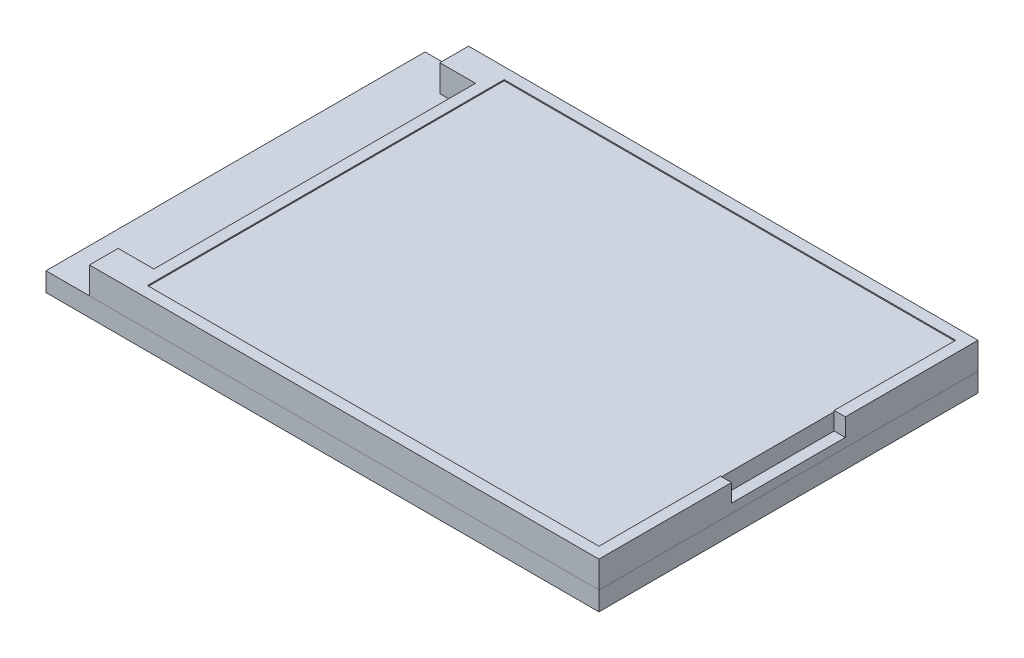
ISO-10303-21;
HEADER;
FILE_DESCRIPTION(('STEP AP214'),'2;1');
FILE_NAME('part.step','',(''),(''),'','','');
FILE_SCHEMA(('AUTOMOTIVE_DESIGN { 1 0 10303 214 1 1 1 1 }'));
ENDSEC;
DATA;
#1=APPLICATION_CONTEXT('core data for automotive mechanical design processes');
#2=APPLICATION_PROTOCOL_DEFINITION('international standard','automotive_design',2000,#1);
#3=PRODUCT_CONTEXT('',#1,'mechanical');
#4=PRODUCT('Part','Part','',(#3));
#5=PRODUCT_RELATED_PRODUCT_CATEGORY('part','',(#4));
#6=PRODUCT_DEFINITION_FORMATION('','',#4);
#7=PRODUCT_DEFINITION_CONTEXT('part definition',#1,'design');
#8=PRODUCT_DEFINITION('design','',#6,#7);
#9=PRODUCT_DEFINITION_SHAPE('','',#8);
#10=(LENGTH_UNIT() NAMED_UNIT(*) SI_UNIT(.MILLI.,.METRE.));
#11=(NAMED_UNIT(*) PLANE_ANGLE_UNIT() SI_UNIT($,.RADIAN.));
#12=(NAMED_UNIT(*) SI_UNIT($,.STERADIAN.) SOLID_ANGLE_UNIT());
#13=UNCERTAINTY_MEASURE_WITH_UNIT(LENGTH_MEASURE(1.E-05),#10,'distance_accuracy_value','');
#14=(GEOMETRIC_REPRESENTATION_CONTEXT(3) GLOBAL_UNCERTAINTY_ASSIGNED_CONTEXT((#13)) GLOBAL_UNIT_ASSIGNED_CONTEXT((#10,
#11,#12)) REPRESENTATION_CONTEXT('',''));
#15=CARTESIAN_POINT('',(0.,0.,0.));
#16=DIRECTION('',(0.,0.,1.));
#17=DIRECTION('',(1.,0.,0.));
#18=AXIS2_PLACEMENT_3D('',#15,#16,#17);
#19=CARTESIAN_POINT('',(23.8,4.,-16.));
#20=DIRECTION('',(1.,0.,0.));
#21=DIRECTION('',(0.,0.,-1.));
#22=AXIS2_PLACEMENT_3D('',#19,#20,#21);
#23=PLANE('',#22);
#24=DIRECTION('',(0.,0.,-1.));
#25=VECTOR('',#24,1.);
#26=CARTESIAN_POINT('',(23.8,4.1,-16.));
#27=LINE('',#26,#25);
#28=CARTESIAN_POINT('',(23.8,4.1,16.));
#29=VERTEX_POINT('',#28);
#30=CARTESIAN_POINT('',(23.8,4.1,5.1));
#31=VERTEX_POINT('',#30);
#32=EDGE_CURVE('E220',#29,#31,#27,.T.);
#33=ORIENTED_EDGE('',*,*,#32,.T.);
#34=DIRECTION('',(0.,1.,0.));
#35=VECTOR('',#34,1.);
#36=CARTESIAN_POINT('',(23.8,2.5,5.1));
#37=LINE('',#36,#35);
#38=CARTESIAN_POINT('',(23.8,4.,5.1));
#39=VERTEX_POINT('',#38);
#40=EDGE_CURVE('E327',#39,#31,#37,.T.);
#41=ORIENTED_EDGE('',*,*,#40,.F.);
#42=DIRECTION('',(0.,0.,-1.));
#43=VECTOR('',#42,1.);
#44=CARTESIAN_POINT('',(23.8,4.,-16.));
#45=LINE('',#44,#43);
#46=CARTESIAN_POINT('',(23.8,4.,16.));
#47=VERTEX_POINT('',#46);
#48=EDGE_CURVE('E206',#47,#39,#45,.T.);
#49=ORIENTED_EDGE('',*,*,#48,.F.);
#50=DIRECTION('',(0.,1.,0.));
#51=VECTOR('',#50,1.);
#52=CARTESIAN_POINT('',(23.8,4.,16.));
#53=LINE('',#52,#51);
#54=EDGE_CURVE('E231',#47,#29,#53,.T.);
#55=ORIENTED_EDGE('',*,*,#54,.T.);
#56=EDGE_LOOP('',(#33,#41,#49,#55));
#57=FACE_BOUND('',#56,.T.);
#58=ADVANCED_FACE('F49',(#57),#23,.F.);
#59=CARTESIAN_POINT('',(0.,4.1,-14.425));
#60=DIRECTION('',(0.,0.,-1.));
#61=DIRECTION('',(-1.,0.,0.));
#62=AXIS2_PLACEMENT_3D('',#59,#60,#61);
#63=PLANE('',#62);
#64=DIRECTION('',(1.,0.,0.));
#65=VECTOR('',#64,1.);
#66=CARTESIAN_POINT('',(0.,1.7,-14.425));
#67=LINE('',#66,#65);
#68=CARTESIAN_POINT('',(-20.9,1.7,-14.425));
#69=VERTEX_POINT('',#68);
#70=CARTESIAN_POINT('',(-17.7,1.7,-14.425));
#71=VERTEX_POINT('',#70);
#72=EDGE_CURVE('E227',#69,#71,#67,.T.);
#73=ORIENTED_EDGE('',*,*,#72,.T.);
#74=DIRECTION('',(0.,-1.,0.));
#75=VECTOR('',#74,1.);
#76=CARTESIAN_POINT('',(-17.7,4.1,-14.425));
#77=LINE('',#76,#75);
#78=CARTESIAN_POINT('',(-17.7,4.1,-14.425));
#79=VERTEX_POINT('',#78);
#80=EDGE_CURVE('E12',#79,#71,#77,.T.);
#81=ORIENTED_EDGE('',*,*,#80,.F.);
#82=DIRECTION('',(1.,0.,0.));
#83=VECTOR('',#82,1.);
#84=CARTESIAN_POINT('',(0.,4.1,-14.425));
#85=LINE('',#84,#83);
#86=CARTESIAN_POINT('',(-20.9,4.1,-14.425));
#87=VERTEX_POINT('',#86);
#88=EDGE_CURVE('E234',#87,#79,#85,.T.);
#89=ORIENTED_EDGE('',*,*,#88,.F.);
#90=DIRECTION('',(0.,-1.,0.));
#91=VECTOR('',#90,1.);
#92=CARTESIAN_POINT('',(-20.9,4.1,-14.425));
#93=LINE('',#92,#91);
#94=EDGE_CURVE('E269',#87,#69,#93,.T.);
#95=ORIENTED_EDGE('',*,*,#94,.T.);
#96=EDGE_LOOP('',(#73,#81,#89,#95));
#97=FACE_BOUND('',#96,.T.);
#98=ADVANCED_FACE('F51',(#97),#63,.F.);
#99=CARTESIAN_POINT('',(-17.7,4.1,0.));
#100=DIRECTION('',(1.,0.,0.));
#101=DIRECTION('',(0.,0.,-1.));
#102=AXIS2_PLACEMENT_3D('',#99,#100,#101);
#103=PLANE('',#102);
#104=DIRECTION('',(0.,0.,1.));
#105=VECTOR('',#104,1.);
#106=CARTESIAN_POINT('',(-17.7,1.7,0.));
#107=LINE('',#106,#105);
#108=CARTESIAN_POINT('',(-17.7,1.7,14.425));
#109=VERTEX_POINT('',#108);
#110=EDGE_CURVE('E255',#71,#109,#107,.T.);
#111=ORIENTED_EDGE('',*,*,#110,.T.);
#112=DIRECTION('',(0.,-1.,0.));
#113=VECTOR('',#112,1.);
#114=CARTESIAN_POINT('',(-17.7,4.1,14.425));
#115=LINE('',#114,#113);
#116=CARTESIAN_POINT('',(-17.7,4.1,14.425));
#117=VERTEX_POINT('',#116);
#118=EDGE_CURVE('E57',#117,#109,#115,.T.);
#119=ORIENTED_EDGE('',*,*,#118,.F.);
#120=DIRECTION('',(0.,0.,1.));
#121=VECTOR('',#120,1.);
#122=CARTESIAN_POINT('',(-17.7,4.1,0.));
#123=LINE('',#122,#121);
#124=EDGE_CURVE('E237',#79,#117,#123,.T.);
#125=ORIENTED_EDGE('',*,*,#124,.F.);
#126=ORIENTED_EDGE('',*,*,#80,.T.);
#127=EDGE_LOOP('',(#111,#119,#125,#126));
#128=FACE_BOUND('',#127,.T.);
#129=ADVANCED_FACE('F291',(#128),#103,.F.);
#130=CARTESIAN_POINT('',(0.,4.1,14.425));
#131=DIRECTION('',(0.,0.,-1.));
#132=DIRECTION('',(-1.,0.,0.));
#133=AXIS2_PLACEMENT_3D('',#130,#131,#132);
#134=PLANE('',#133);
#135=DIRECTION('',(1.,0.,0.));
#136=VECTOR('',#135,1.);
#137=CARTESIAN_POINT('',(0.,1.7,14.425));
#138=LINE('',#137,#136);
#139=CARTESIAN_POINT('',(-20.9,1.7,14.425));
#140=VERTEX_POINT('',#139);
#141=EDGE_CURVE('E258',#140,#109,#138,.T.);
#142=ORIENTED_EDGE('',*,*,#141,.F.);
#143=DIRECTION('',(0.,-1.,0.));
#144=VECTOR('',#143,1.);
#145=CARTESIAN_POINT('',(-20.9,4.1,14.425));
#146=LINE('',#145,#144);
#147=CARTESIAN_POINT('',(-20.9,4.1,14.425));
#148=VERTEX_POINT('',#147);
#149=EDGE_CURVE('E284',#148,#140,#146,.T.);
#150=ORIENTED_EDGE('',*,*,#149,.F.);
#151=DIRECTION('',(1.,0.,0.));
#152=VECTOR('',#151,1.);
#153=CARTESIAN_POINT('',(0.,4.1,14.425));
#154=LINE('',#153,#152);
#155=EDGE_CURVE('E240',#148,#117,#154,.T.);
#156=ORIENTED_EDGE('',*,*,#155,.T.);
#157=ORIENTED_EDGE('',*,*,#118,.T.);
#158=EDGE_LOOP('',(#142,#150,#156,#157));
#159=FACE_BOUND('',#158,.T.);
#160=ADVANCED_FACE('F288',(#159),#134,.T.);
#161=CARTESIAN_POINT('',(-20.9,4.1,0.));
#162=DIRECTION('',(1.,0.,0.));
#163=DIRECTION('',(0.,0.,-1.));
#164=AXIS2_PLACEMENT_3D('',#161,#162,#163);
#165=PLANE('',#164);
#166=DIRECTION('',(0.,0.,1.));
#167=VECTOR('',#166,1.);
#168=CARTESIAN_POINT('',(-20.9,1.7,0.));
#169=LINE('',#168,#167);
#170=CARTESIAN_POINT('',(-20.9,1.7,17.));
#171=VERTEX_POINT('',#170);
#172=EDGE_CURVE('E261',#140,#171,#169,.T.);
#173=ORIENTED_EDGE('',*,*,#172,.T.);
#174=DIRECTION('',(0.,-1.,0.));
#175=VECTOR('',#174,1.);
#176=CARTESIAN_POINT('',(-20.9,4.1,17.));
#177=LINE('',#176,#175);
#178=CARTESIAN_POINT('',(-20.9,4.1,17.));
#179=VERTEX_POINT('',#178);
#180=EDGE_CURVE('E281',#179,#171,#177,.T.);
#181=ORIENTED_EDGE('',*,*,#180,.F.);
#182=DIRECTION('',(0.,0.,1.));
#183=VECTOR('',#182,1.);
#184=CARTESIAN_POINT('',(-20.9,4.1,0.));
#185=LINE('',#184,#183);
#186=EDGE_CURVE('E243',#148,#179,#185,.T.);
#187=ORIENTED_EDGE('',*,*,#186,.F.);
#188=ORIENTED_EDGE('',*,*,#149,.T.);
#189=EDGE_LOOP('',(#173,#181,#187,#188));
#190=FACE_BOUND('',#189,.T.);
#191=ADVANCED_FACE('F301',(#190),#165,.F.);
#192=CARTESIAN_POINT('',(0.,4.1,17.));
#193=DIRECTION('',(0.,0.,-1.));
#194=DIRECTION('',(-1.,0.,0.));
#195=AXIS2_PLACEMENT_3D('',#192,#193,#194);
#196=PLANE('',#195);
#197=DIRECTION('',(1.,0.,0.));
#198=VECTOR('',#197,1.);
#199=CARTESIAN_POINT('',(0.,1.7,17.));
#200=LINE('',#199,#198);
#201=CARTESIAN_POINT('',(24.8,1.7,17.));
#202=VERTEX_POINT('',#201);
#203=EDGE_CURVE('E263',#171,#202,#200,.T.);
#204=ORIENTED_EDGE('',*,*,#203,.T.);
#205=DIRECTION('',(0.,-1.,0.));
#206=VECTOR('',#205,1.);
#207=CARTESIAN_POINT('',(24.8,4.1,17.));
#208=LINE('',#207,#206);
#209=CARTESIAN_POINT('',(24.8,4.1,17.));
#210=VERTEX_POINT('',#209);
#211=EDGE_CURVE('E278',#210,#202,#208,.T.);
#212=ORIENTED_EDGE('',*,*,#211,.F.);
#213=DIRECTION('',(1.,0.,0.));
#214=VECTOR('',#213,1.);
#215=CARTESIAN_POINT('',(0.,4.1,17.));
#216=LINE('',#215,#214);
#217=EDGE_CURVE('E245',#179,#210,#216,.T.);
#218=ORIENTED_EDGE('',*,*,#217,.F.);
#219=ORIENTED_EDGE('',*,*,#180,.T.);
#220=EDGE_LOOP('',(#204,#212,#218,#219));
#221=FACE_BOUND('',#220,.T.);
#222=ADVANCED_FACE('F305',(#221),#196,.F.);
#223=CARTESIAN_POINT('',(24.8,4.1,0.));
#224=DIRECTION('',(-1.,0.,0.));
#225=DIRECTION('',(0.,0.,1.));
#226=AXIS2_PLACEMENT_3D('',#223,#224,#225);
#227=PLANE('',#226);
#228=DIRECTION('',(0.,0.,-1.));
#229=VECTOR('',#228,1.);
#230=CARTESIAN_POINT('',(24.8,2.5,-5.1));
#231=LINE('',#230,#229);
#232=CARTESIAN_POINT('',(24.8,2.5,5.1));
#233=VERTEX_POINT('',#232);
#234=CARTESIAN_POINT('',(24.8,2.5,-5.1));
#235=VERTEX_POINT('',#234);
#236=EDGE_CURVE('E176',#233,#235,#231,.T.);
#237=ORIENTED_EDGE('',*,*,#236,.F.);
#238=DIRECTION('',(0.,1.,0.));
#239=VECTOR('',#238,1.);
#240=CARTESIAN_POINT('',(24.8,2.5,5.1));
#241=LINE('',#240,#239);
#242=CARTESIAN_POINT('',(24.8,4.1,5.1));
#243=VERTEX_POINT('',#242);
#244=EDGE_CURVE('E216',#233,#243,#241,.T.);
#245=ORIENTED_EDGE('',*,*,#244,.T.);
#246=DIRECTION('',(0.,0.,-1.));
#247=VECTOR('',#246,1.);
#248=CARTESIAN_POINT('',(24.8,4.1,0.));
#249=LINE('',#248,#247);
#250=EDGE_CURVE('E248',#210,#243,#249,.T.);
#251=ORIENTED_EDGE('',*,*,#250,.F.);
#252=ORIENTED_EDGE('',*,*,#211,.T.);
#253=DIRECTION('',(0.,0.,-1.));
#254=VECTOR('',#253,1.);
#255=CARTESIAN_POINT('',(24.8,1.7,0.));
#256=LINE('',#255,#254);
#257=CARTESIAN_POINT('',(24.8,1.7,-17.));
#258=VERTEX_POINT('',#257);
#259=EDGE_CURVE('E265',#202,#258,#256,.T.);
#260=ORIENTED_EDGE('',*,*,#259,.T.);
#261=DIRECTION('',(0.,-1.,0.));
#262=VECTOR('',#261,1.);
#263=CARTESIAN_POINT('',(24.8,4.1,-17.));
#264=LINE('',#263,#262);
#265=CARTESIAN_POINT('',(24.8,4.1,-17.));
#266=VERTEX_POINT('',#265);
#267=EDGE_CURVE('E275',#266,#258,#264,.T.);
#268=ORIENTED_EDGE('',*,*,#267,.F.);
#269=CARTESIAN_POINT('',(24.8,4.1,-5.1));
#270=VERTEX_POINT('',#269);
#271=EDGE_CURVE('E190',#270,#266,#249,.T.);
#272=ORIENTED_EDGE('',*,*,#271,.F.);
#273=DIRECTION('',(0.,1.,0.));
#274=VECTOR('',#273,1.);
#275=CARTESIAN_POINT('',(24.8,2.5,-5.1));
#276=LINE('',#275,#274);
#277=EDGE_CURVE('E171',#235,#270,#276,.T.);
#278=ORIENTED_EDGE('',*,*,#277,.F.);
#279=EDGE_LOOP('',(#237,#245,#251,#252,#260,#268,#272,#278));
#280=FACE_BOUND('',#279,.T.);
#281=ADVANCED_FACE('F188',(#280),#227,.F.);
#282=CARTESIAN_POINT('',(0.,4.1,-17.));
#283=DIRECTION('',(0.,0.,1.));
#284=DIRECTION('',(1.,0.,0.));
#285=AXIS2_PLACEMENT_3D('',#282,#283,#284);
#286=PLANE('',#285);
#287=DIRECTION('',(-1.,0.,0.));
#288=VECTOR('',#287,1.);
#289=CARTESIAN_POINT('',(0.,1.7,-17.));
#290=LINE('',#289,#288);
#291=CARTESIAN_POINT('',(-20.9,1.7,-17.));
#292=VERTEX_POINT('',#291);
#293=EDGE_CURVE('E267',#258,#292,#290,.T.);
#294=ORIENTED_EDGE('',*,*,#293,.T.);
#295=DIRECTION('',(0.,-1.,0.));
#296=VECTOR('',#295,1.);
#297=CARTESIAN_POINT('',(-20.9,4.1,-17.));
#298=LINE('',#297,#296);
#299=CARTESIAN_POINT('',(-20.9,4.1,-17.));
#300=VERTEX_POINT('',#299);
#301=EDGE_CURVE('E272',#300,#292,#298,.T.);
#302=ORIENTED_EDGE('',*,*,#301,.F.);
#303=DIRECTION('',(-1.,0.,0.));
#304=VECTOR('',#303,1.);
#305=CARTESIAN_POINT('',(0.,4.1,-17.));
#306=LINE('',#305,#304);
#307=EDGE_CURVE('E251',#266,#300,#306,.T.);
#308=ORIENTED_EDGE('',*,*,#307,.F.);
#309=ORIENTED_EDGE('',*,*,#267,.T.);
#310=EDGE_LOOP('',(#294,#302,#308,#309));
#311=FACE_BOUND('',#310,.T.);
#312=ADVANCED_FACE('F322',(#311),#286,.F.);
#313=EDGE_CURVE('E238',#292,#69,#169,.T.);
#314=ORIENTED_EDGE('',*,*,#313,.T.);
#315=ORIENTED_EDGE('',*,*,#94,.F.);
#316=EDGE_CURVE('E246',#300,#87,#185,.T.);
#317=ORIENTED_EDGE('',*,*,#316,.F.);
#318=ORIENTED_EDGE('',*,*,#301,.T.);
#319=EDGE_LOOP('',(#314,#315,#317,#318));
#320=FACE_BOUND('',#319,.T.);
#321=ADVANCED_FACE('F318',(#320),#165,.F.);
#322=CARTESIAN_POINT('',(0.,4.1,0.));
#323=DIRECTION('',(0.,1.,0.));
#324=DIRECTION('',(0.,0.,1.));
#325=AXIS2_PLACEMENT_3D('',#322,#323,#324);
#326=PLANE('',#325);
#327=DIRECTION('',(1.,0.,0.));
#328=VECTOR('',#327,1.);
#329=CARTESIAN_POINT('',(24.8,4.1,5.1));
#330=LINE('',#329,#328);
#331=EDGE_CURVE('E185',#31,#243,#330,.T.);
#332=ORIENTED_EDGE('',*,*,#331,.F.);
#333=ORIENTED_EDGE('',*,*,#32,.F.);
#334=DIRECTION('',(1.,0.,0.));
#335=VECTOR('',#334,1.);
#336=CARTESIAN_POINT('',(-16.7,4.1,16.));
#337=LINE('',#336,#335);
#338=CARTESIAN_POINT('',(-16.7,4.1,16.));
#339=VERTEX_POINT('',#338);
#340=EDGE_CURVE('E215',#339,#29,#337,.T.);
#341=ORIENTED_EDGE('',*,*,#340,.F.);
#342=DIRECTION('',(0.,0.,1.));
#343=VECTOR('',#342,1.);
#344=CARTESIAN_POINT('',(-16.7,4.1,-16.));
#345=LINE('',#344,#343);
#346=CARTESIAN_POINT('',(-16.7,4.1,-16.));
#347=VERTEX_POINT('',#346);
#348=EDGE_CURVE('E72',#347,#339,#345,.T.);
#349=ORIENTED_EDGE('',*,*,#348,.F.);
#350=DIRECTION('',(-1.,0.,0.));
#351=VECTOR('',#350,1.);
#352=CARTESIAN_POINT('',(-16.7,4.1,-16.));
#353=LINE('',#352,#351);
#354=CARTESIAN_POINT('',(23.8,4.1,-16.));
#355=VERTEX_POINT('',#354);
#356=EDGE_CURVE('E202',#355,#347,#353,.T.);
#357=ORIENTED_EDGE('',*,*,#356,.F.);
#358=CARTESIAN_POINT('',(23.8,4.1,-5.1));
#359=VERTEX_POINT('',#358);
#360=EDGE_CURVE('E219',#359,#355,#27,.T.);
#361=ORIENTED_EDGE('',*,*,#360,.F.);
#362=DIRECTION('',(-1.,0.,0.));
#363=VECTOR('',#362,1.);
#364=CARTESIAN_POINT('',(24.8,4.1,-5.1));
#365=LINE('',#364,#363);
#366=EDGE_CURVE('E330',#270,#359,#365,.T.);
#367=ORIENTED_EDGE('',*,*,#366,.F.);
#368=ORIENTED_EDGE('',*,*,#271,.T.);
#369=ORIENTED_EDGE('',*,*,#307,.T.);
#370=ORIENTED_EDGE('',*,*,#316,.T.);
#371=ORIENTED_EDGE('',*,*,#88,.T.);
#372=ORIENTED_EDGE('',*,*,#124,.T.);
#373=ORIENTED_EDGE('',*,*,#155,.F.);
#374=ORIENTED_EDGE('',*,*,#186,.T.);
#375=ORIENTED_EDGE('',*,*,#217,.T.);
#376=ORIENTED_EDGE('',*,*,#250,.T.);
#377=EDGE_LOOP('',(#332,#333,#341,#349,#357,#361,#367,#368,#369,#370,#371,#372,#373,#374,#375,#376));
#378=FACE_BOUND('',#377,.T.);
#379=ADVANCED_FACE('F310',(#378),#326,.T.);
#380=CARTESIAN_POINT('',(0.,1.7,0.));
#381=DIRECTION('',(0.,1.,0.));
#382=DIRECTION('',(0.,0.,1.));
#383=AXIS2_PLACEMENT_3D('',#380,#381,#382);
#384=PLANE('',#383);
#385=ORIENTED_EDGE('',*,*,#72,.F.);
#386=ORIENTED_EDGE('',*,*,#313,.F.);
#387=ORIENTED_EDGE('',*,*,#293,.F.);
#388=ORIENTED_EDGE('',*,*,#259,.F.);
#389=ORIENTED_EDGE('',*,*,#203,.F.);
#390=ORIENTED_EDGE('',*,*,#172,.F.);
#391=ORIENTED_EDGE('',*,*,#141,.T.);
#392=ORIENTED_EDGE('',*,*,#110,.F.);
#393=EDGE_LOOP('',(#385,#386,#387,#388,#389,#390,#391,#392));
#394=FACE_BOUND('',#393,.T.);
#395=ADVANCED_FACE('F296',(#394),#384,.F.);
#396=CARTESIAN_POINT('',(-16.7,4.,-16.));
#397=DIRECTION('',(-1.,0.,0.));
#398=DIRECTION('',(0.,0.,1.));
#399=AXIS2_PLACEMENT_3D('',#396,#397,#398);
#400=PLANE('',#399);
#401=ORIENTED_EDGE('',*,*,#348,.T.);
#402=DIRECTION('',(0.,1.,0.));
#403=VECTOR('',#402,1.);
#404=CARTESIAN_POINT('',(-16.7,4.,16.));
#405=LINE('',#404,#403);
#406=CARTESIAN_POINT('',(-16.7,4.,16.));
#407=VERTEX_POINT('',#406);
#408=EDGE_CURVE('E213',#407,#339,#405,.T.);
#409=ORIENTED_EDGE('',*,*,#408,.F.);
#410=DIRECTION('',(0.,0.,1.));
#411=VECTOR('',#410,1.);
#412=CARTESIAN_POINT('',(-16.7,4.,-16.));
#413=LINE('',#412,#411);
#414=CARTESIAN_POINT('',(-16.7,4.,-16.));
#415=VERTEX_POINT('',#414);
#416=EDGE_CURVE('E198',#415,#407,#413,.T.);
#417=ORIENTED_EDGE('',*,*,#416,.F.);
#418=DIRECTION('',(0.,1.,0.));
#419=VECTOR('',#418,1.);
#420=CARTESIAN_POINT('',(-16.7,4.,-16.));
#421=LINE('',#420,#419);
#422=EDGE_CURVE('E225',#415,#347,#421,.T.);
#423=ORIENTED_EDGE('',*,*,#422,.T.);
#424=EDGE_LOOP('',(#401,#409,#417,#423));
#425=FACE_BOUND('',#424,.T.);
#426=ADVANCED_FACE('F361',(#425),#400,.F.);
#427=CARTESIAN_POINT('',(-16.7,4.,-16.));
#428=DIRECTION('',(0.,0.,-1.));
#429=DIRECTION('',(-1.,0.,0.));
#430=AXIS2_PLACEMENT_3D('',#427,#428,#429);
#431=PLANE('',#430);
#432=ORIENTED_EDGE('',*,*,#356,.T.);
#433=ORIENTED_EDGE('',*,*,#422,.F.);
#434=DIRECTION('',(-1.,0.,0.));
#435=VECTOR('',#434,1.);
#436=CARTESIAN_POINT('',(-16.7,4.,-16.));
#437=LINE('',#436,#435);
#438=CARTESIAN_POINT('',(23.8,4.,-16.));
#439=VERTEX_POINT('',#438);
#440=EDGE_CURVE('E209',#439,#415,#437,.T.);
#441=ORIENTED_EDGE('',*,*,#440,.F.);
#442=DIRECTION('',(0.,1.,0.));
#443=VECTOR('',#442,1.);
#444=CARTESIAN_POINT('',(23.8,4.,-16.));
#445=LINE('',#444,#443);
#446=EDGE_CURVE('E228',#439,#355,#445,.T.);
#447=ORIENTED_EDGE('',*,*,#446,.T.);
#448=EDGE_LOOP('',(#432,#433,#441,#447));
#449=FACE_BOUND('',#448,.T.);
#450=ADVANCED_FACE('F348',(#449),#431,.F.);
#451=CARTESIAN_POINT('',(23.8,4.,-5.1));
#452=VERTEX_POINT('',#451);
#453=EDGE_CURVE('E205',#452,#439,#45,.T.);
#454=ORIENTED_EDGE('',*,*,#453,.F.);
#455=DIRECTION('',(0.,1.,0.));
#456=VECTOR('',#455,1.);
#457=CARTESIAN_POINT('',(23.8,2.5,-5.1));
#458=LINE('',#457,#456);
#459=EDGE_CURVE('E191',#452,#359,#458,.T.);
#460=ORIENTED_EDGE('',*,*,#459,.T.);
#461=ORIENTED_EDGE('',*,*,#360,.T.);
#462=ORIENTED_EDGE('',*,*,#446,.F.);
#463=EDGE_LOOP('',(#454,#460,#461,#462));
#464=FACE_BOUND('',#463,.T.);
#465=ADVANCED_FACE('F353',(#464),#23,.F.);
#466=CARTESIAN_POINT('',(-16.7,4.,16.));
#467=DIRECTION('',(0.,0.,1.));
#468=DIRECTION('',(1.,0.,0.));
#469=AXIS2_PLACEMENT_3D('',#466,#467,#468);
#470=PLANE('',#469);
#471=ORIENTED_EDGE('',*,*,#340,.T.);
#472=ORIENTED_EDGE('',*,*,#54,.F.);
#473=DIRECTION('',(1.,0.,0.));
#474=VECTOR('',#473,1.);
#475=CARTESIAN_POINT('',(-16.7,4.,16.));
#476=LINE('',#475,#474);
#477=EDGE_CURVE('E201',#407,#47,#476,.T.);
#478=ORIENTED_EDGE('',*,*,#477,.F.);
#479=ORIENTED_EDGE('',*,*,#408,.T.);
#480=EDGE_LOOP('',(#471,#472,#478,#479));
#481=FACE_BOUND('',#480,.T.);
#482=ADVANCED_FACE('F343',(#481),#470,.F.);
#483=CARTESIAN_POINT('',(0.,4.,0.));
#484=DIRECTION('',(0.,1.,0.));
#485=DIRECTION('',(0.,0.,1.));
#486=AXIS2_PLACEMENT_3D('',#483,#484,#485);
#487=PLANE('',#486);
#488=ORIENTED_EDGE('',*,*,#416,.T.);
#489=ORIENTED_EDGE('',*,*,#477,.T.);
#490=ORIENTED_EDGE('',*,*,#48,.T.);
#491=EDGE_CURVE('E210',#39,#452,#45,.T.);
#492=ORIENTED_EDGE('',*,*,#491,.T.);
#493=ORIENTED_EDGE('',*,*,#453,.T.);
#494=ORIENTED_EDGE('',*,*,#440,.T.);
#495=EDGE_LOOP('',(#488,#489,#490,#492,#493,#494));
#496=FACE_BOUND('',#495,.T.);
#497=ADVANCED_FACE('F339',(#496),#487,.T.);
#498=CARTESIAN_POINT('',(24.8,2.5,5.1));
#499=DIRECTION('',(0.,0.,1.));
#500=DIRECTION('',(1.,0.,0.));
#501=AXIS2_PLACEMENT_3D('',#498,#499,#500);
#502=PLANE('',#501);
#503=ORIENTED_EDGE('',*,*,#331,.T.);
#504=ORIENTED_EDGE('',*,*,#244,.F.);
#505=DIRECTION('',(1.,0.,0.));
#506=VECTOR('',#505,1.);
#507=CARTESIAN_POINT('',(24.8,2.5,5.1));
#508=LINE('',#507,#506);
#509=CARTESIAN_POINT('',(23.8,2.5,5.1));
#510=VERTEX_POINT('',#509);
#511=EDGE_CURVE('E182',#510,#233,#508,.T.);
#512=ORIENTED_EDGE('',*,*,#511,.F.);
#513=EDGE_CURVE('E324',#510,#39,#37,.T.);
#514=ORIENTED_EDGE('',*,*,#513,.T.);
#515=ORIENTED_EDGE('',*,*,#40,.T.);
#516=EDGE_LOOP('',(#503,#504,#512,#514,#515));
#517=FACE_BOUND('',#516,.T.);
#518=ADVANCED_FACE('F332',(#517),#502,.F.);
#519=CARTESIAN_POINT('',(23.8,2.5,-5.1));
#520=DIRECTION('',(-1.,0.,0.));
#521=DIRECTION('',(0.,0.,1.));
#522=AXIS2_PLACEMENT_3D('',#519,#520,#521);
#523=PLANE('',#522);
#524=ORIENTED_EDGE('',*,*,#491,.F.);
#525=ORIENTED_EDGE('',*,*,#513,.F.);
#526=DIRECTION('',(0.,0.,1.));
#527=VECTOR('',#526,1.);
#528=CARTESIAN_POINT('',(23.8,2.5,-5.1));
#529=LINE('',#528,#527);
#530=CARTESIAN_POINT('',(23.8,2.5,-5.1));
#531=VERTEX_POINT('',#530);
#532=EDGE_CURVE('E175',#531,#510,#529,.T.);
#533=ORIENTED_EDGE('',*,*,#532,.F.);
#534=EDGE_CURVE('E64',#531,#452,#458,.T.);
#535=ORIENTED_EDGE('',*,*,#534,.T.);
#536=EDGE_LOOP('',(#524,#525,#533,#535));
#537=FACE_BOUND('',#536,.T.);
#538=ADVANCED_FACE('F444',(#537),#523,.F.);
#539=CARTESIAN_POINT('',(24.8,2.5,-5.1));
#540=DIRECTION('',(0.,0.,-1.));
#541=DIRECTION('',(-1.,0.,0.));
#542=AXIS2_PLACEMENT_3D('',#539,#540,#541);
#543=PLANE('',#542);
#544=ORIENTED_EDGE('',*,*,#366,.T.);
#545=ORIENTED_EDGE('',*,*,#459,.F.);
#546=ORIENTED_EDGE('',*,*,#534,.F.);
#547=DIRECTION('',(-1.,0.,0.));
#548=VECTOR('',#547,1.);
#549=CARTESIAN_POINT('',(24.8,2.5,-5.1));
#550=LINE('',#549,#548);
#551=EDGE_CURVE('E167',#235,#531,#550,.T.);
#552=ORIENTED_EDGE('',*,*,#551,.F.);
#553=ORIENTED_EDGE('',*,*,#277,.T.);
#554=EDGE_LOOP('',(#544,#545,#546,#552,#553));
#555=FACE_BOUND('',#554,.T.);
#556=ADVANCED_FACE('F169',(#555),#543,.F.);
#557=CARTESIAN_POINT('',(0.,2.5,0.));
#558=DIRECTION('',(0.,-1.,0.));
#559=DIRECTION('',(0.,0.,-1.));
#560=AXIS2_PLACEMENT_3D('',#557,#558,#559);
#561=PLANE('',#560);
#562=ORIENTED_EDGE('',*,*,#236,.T.);
#563=ORIENTED_EDGE('',*,*,#551,.T.);
#564=ORIENTED_EDGE('',*,*,#532,.T.);
#565=ORIENTED_EDGE('',*,*,#511,.T.);
#566=EDGE_LOOP('',(#562,#563,#564,#565));
#567=FACE_BOUND('',#566,.T.);
#568=ADVANCED_FACE('F180',(#567),#561,.F.);
#569=CLOSED_SHELL('',(#58,#98,#129,#160,#191,#222,#281,#312,#321,#379,#395,#426,#450,#465,#482,
#497,#518,#538,#556,#568));
#570=MANIFOLD_SOLID_BREP('B2',#569);
#571=CARTESIAN_POINT('',(24.8,1.7,-17.));
#572=DIRECTION('',(-1.,0.,0.));
#573=DIRECTION('',(0.,0.,1.));
#574=AXIS2_PLACEMENT_3D('',#571,#572,#573);
#575=PLANE('',#574);
#576=DIRECTION('',(0.,0.,-1.));
#577=VECTOR('',#576,1.);
#578=CARTESIAN_POINT('',(24.8,0.,-17.));
#579=LINE('',#578,#577);
#580=CARTESIAN_POINT('',(24.8,0.,17.));
#581=VERTEX_POINT('',#580);
#582=CARTESIAN_POINT('',(24.8,0.,-17.));
#583=VERTEX_POINT('',#582);
#584=EDGE_CURVE('E595',#581,#583,#579,.T.);
#585=ORIENTED_EDGE('',*,*,#584,.T.);
#586=DIRECTION('',(0.,-1.,0.));
#587=VECTOR('',#586,1.);
#588=CARTESIAN_POINT('',(24.8,1.7,-17.));
#589=LINE('',#588,#587);
#590=CARTESIAN_POINT('',(24.8,1.7,-17.));
#591=VERTEX_POINT('',#590);
#592=EDGE_CURVE('E47',#591,#583,#589,.T.);
#593=ORIENTED_EDGE('',*,*,#592,.F.);
#594=DIRECTION('',(0.,0.,-1.));
#595=VECTOR('',#594,1.);
#596=CARTESIAN_POINT('',(24.8,1.7,-17.));
#597=LINE('',#596,#595);
#598=CARTESIAN_POINT('',(24.8,1.7,17.));
#599=VERTEX_POINT('',#598);
#600=EDGE_CURVE('E583',#599,#591,#597,.T.);
#601=ORIENTED_EDGE('',*,*,#600,.F.);
#602=DIRECTION('',(0.,-1.,0.));
#603=VECTOR('',#602,1.);
#604=CARTESIAN_POINT('',(24.8,1.7,17.));
#605=LINE('',#604,#603);
#606=EDGE_CURVE('E591',#599,#581,#605,.T.);
#607=ORIENTED_EDGE('',*,*,#606,.T.);
#608=EDGE_LOOP('',(#585,#593,#601,#607));
#609=FACE_BOUND('',#608,.T.);
#610=ADVANCED_FACE('F532',(#609),#575,.F.);
#611=CARTESIAN_POINT('',(-24.8,1.7,-17.));
#612=DIRECTION('',(0.,0.,1.));
#613=DIRECTION('',(1.,0.,0.));
#614=AXIS2_PLACEMENT_3D('',#611,#612,#613);
#615=PLANE('',#614);
#616=DIRECTION('',(-1.,0.,0.));
#617=VECTOR('',#616,1.);
#618=CARTESIAN_POINT('',(-24.8,0.,-17.));
#619=LINE('',#618,#617);
#620=CARTESIAN_POINT('',(-24.8,0.,-17.));
#621=VERTEX_POINT('',#620);
#622=EDGE_CURVE('E587',#583,#621,#619,.T.);
#623=ORIENTED_EDGE('',*,*,#622,.T.);
#624=DIRECTION('',(0.,-1.,0.));
#625=VECTOR('',#624,1.);
#626=CARTESIAN_POINT('',(-24.8,1.7,-17.));
#627=LINE('',#626,#625);
#628=CARTESIAN_POINT('',(-24.8,1.7,-17.));
#629=VERTEX_POINT('',#628);
#630=EDGE_CURVE('E540',#629,#621,#627,.T.);
#631=ORIENTED_EDGE('',*,*,#630,.F.);
#632=DIRECTION('',(-1.,0.,0.));
#633=VECTOR('',#632,1.);
#634=CARTESIAN_POINT('',(-24.8,1.7,-17.));
#635=LINE('',#634,#633);
#636=EDGE_CURVE('E578',#591,#629,#635,.T.);
#637=ORIENTED_EDGE('',*,*,#636,.F.);
#638=ORIENTED_EDGE('',*,*,#592,.T.);
#639=EDGE_LOOP('',(#623,#631,#637,#638));
#640=FACE_BOUND('',#639,.T.);
#641=ADVANCED_FACE('F586',(#640),#615,.F.);
#642=CARTESIAN_POINT('',(-24.8,1.7,-17.));
#643=DIRECTION('',(1.,0.,0.));
#644=DIRECTION('',(0.,0.,-1.));
#645=AXIS2_PLACEMENT_3D('',#642,#643,#644);
#646=PLANE('',#645);
#647=DIRECTION('',(0.,0.,1.));
#648=VECTOR('',#647,1.);
#649=CARTESIAN_POINT('',(-24.8,0.,-17.));
#650=LINE('',#649,#648);
#651=CARTESIAN_POINT('',(-24.8,0.,17.));
#652=VERTEX_POINT('',#651);
#653=EDGE_CURVE('E565',#621,#652,#650,.T.);
#654=ORIENTED_EDGE('',*,*,#653,.T.);
#655=DIRECTION('',(0.,-1.,0.));
#656=VECTOR('',#655,1.);
#657=CARTESIAN_POINT('',(-24.8,1.7,17.));
#658=LINE('',#657,#656);
#659=CARTESIAN_POINT('',(-24.8,1.7,17.));
#660=VERTEX_POINT('',#659);
#661=EDGE_CURVE('E588',#660,#652,#658,.T.);
#662=ORIENTED_EDGE('',*,*,#661,.F.);
#663=DIRECTION('',(0.,0.,1.));
#664=VECTOR('',#663,1.);
#665=CARTESIAN_POINT('',(-24.8,1.7,-17.));
#666=LINE('',#665,#664);
#667=EDGE_CURVE('E581',#629,#660,#666,.T.);
#668=ORIENTED_EDGE('',*,*,#667,.F.);
#669=ORIENTED_EDGE('',*,*,#630,.T.);
#670=EDGE_LOOP('',(#654,#662,#668,#669));
#671=FACE_BOUND('',#670,.T.);
#672=ADVANCED_FACE('F589',(#671),#646,.F.);
#673=CARTESIAN_POINT('',(-24.8,1.7,17.));
#674=DIRECTION('',(0.,0.,-1.));
#675=DIRECTION('',(-1.,0.,0.));
#676=AXIS2_PLACEMENT_3D('',#673,#674,#675);
#677=PLANE('',#676);
#678=DIRECTION('',(1.,0.,0.));
#679=VECTOR('',#678,1.);
#680=CARTESIAN_POINT('',(-24.8,0.,17.));
#681=LINE('',#680,#679);
#682=EDGE_CURVE('E571',#652,#581,#681,.T.);
#683=ORIENTED_EDGE('',*,*,#682,.T.);
#684=ORIENTED_EDGE('',*,*,#606,.F.);
#685=DIRECTION('',(1.,0.,0.));
#686=VECTOR('',#685,1.);
#687=CARTESIAN_POINT('',(-24.8,1.7,17.));
#688=LINE('',#687,#686);
#689=EDGE_CURVE('E548',#660,#599,#688,.T.);
#690=ORIENTED_EDGE('',*,*,#689,.F.);
#691=ORIENTED_EDGE('',*,*,#661,.T.);
#692=EDGE_LOOP('',(#683,#684,#690,#691));
#693=FACE_BOUND('',#692,.T.);
#694=ADVANCED_FACE('F602',(#693),#677,.F.);
#695=CARTESIAN_POINT('',(0.,1.7,0.));
#696=DIRECTION('',(0.,1.,0.));
#697=DIRECTION('',(0.,0.,1.));
#698=AXIS2_PLACEMENT_3D('',#695,#696,#697);
#699=PLANE('',#698);
#700=ORIENTED_EDGE('',*,*,#600,.T.);
#701=ORIENTED_EDGE('',*,*,#636,.T.);
#702=ORIENTED_EDGE('',*,*,#667,.T.);
#703=ORIENTED_EDGE('',*,*,#689,.T.);
#704=EDGE_LOOP('',(#700,#701,#702,#703));
#705=FACE_BOUND('',#704,.T.);
#706=ADVANCED_FACE('F579',(#705),#699,.T.);
#707=CARTESIAN_POINT('',(0.,0.,0.));
#708=DIRECTION('',(0.,1.,0.));
#709=DIRECTION('',(0.,0.,1.));
#710=AXIS2_PLACEMENT_3D('',#707,#708,#709);
#711=PLANE('',#710);
#712=ORIENTED_EDGE('',*,*,#584,.F.);
#713=ORIENTED_EDGE('',*,*,#682,.F.);
#714=ORIENTED_EDGE('',*,*,#653,.F.);
#715=ORIENTED_EDGE('',*,*,#622,.F.);
#716=EDGE_LOOP('',(#712,#713,#714,#715));
#717=FACE_BOUND('',#716,.T.);
#718=ADVANCED_FACE('F605',(#717),#711,.F.);
#719=CLOSED_SHELL('',(#610,#641,#672,#694,#706,#718));
#720=MANIFOLD_SOLID_BREP('B6',#719);
#721=ADVANCED_BREP_SHAPE_REPRESENTATION('',(#18,#570,#720),#14);
#722=SHAPE_DEFINITION_REPRESENTATION(#9,#721);
ENDSEC;
END-ISO-10303-21;
